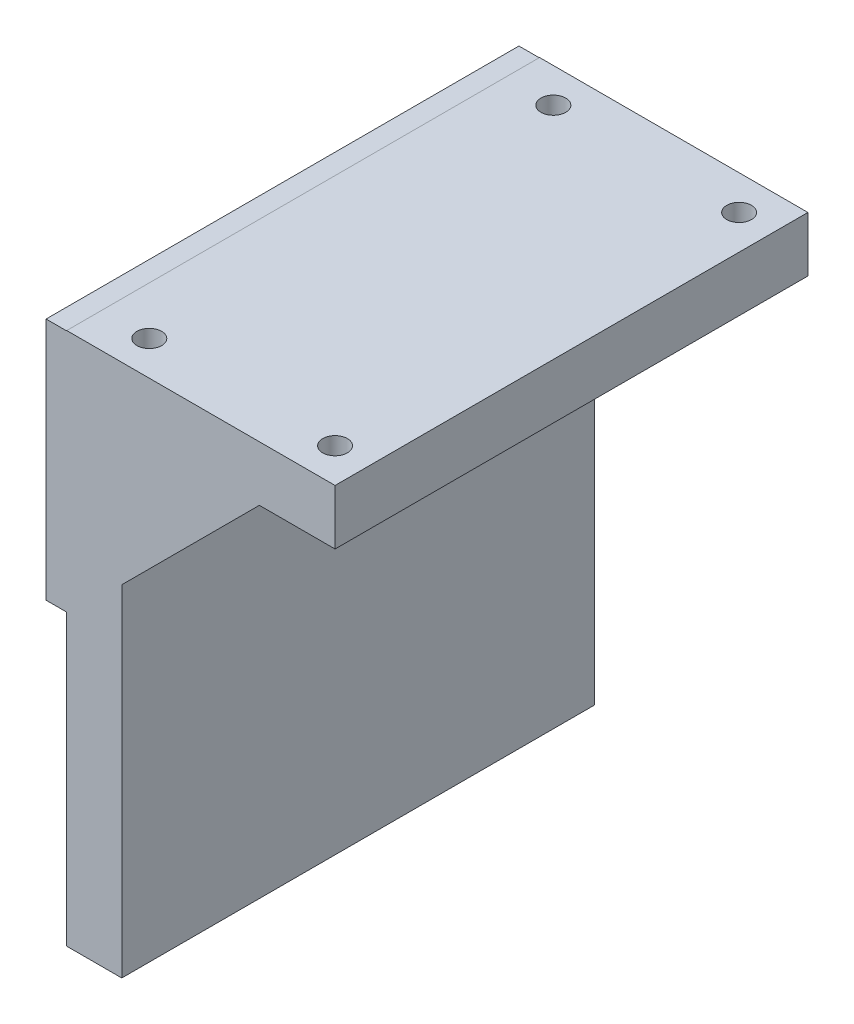
ISO-10303-21;
HEADER;
FILE_DESCRIPTION(('STEP AP214'),'2;1');
FILE_NAME('part.step','',(''),(''),'','','');
FILE_SCHEMA(('AUTOMOTIVE_DESIGN { 1 0 10303 214 1 1 1 1 }'));
ENDSEC;
DATA;
#1=APPLICATION_CONTEXT('core data for automotive mechanical design processes');
#2=APPLICATION_PROTOCOL_DEFINITION('international standard','automotive_design',2000,#1);
#3=PRODUCT_CONTEXT('',#1,'mechanical');
#4=PRODUCT('Part','Part','',(#3));
#5=PRODUCT_RELATED_PRODUCT_CATEGORY('part','',(#4));
#6=PRODUCT_DEFINITION_FORMATION('','',#4);
#7=PRODUCT_DEFINITION_CONTEXT('part definition',#1,'design');
#8=PRODUCT_DEFINITION('design','',#6,#7);
#9=PRODUCT_DEFINITION_SHAPE('','',#8);
#10=(LENGTH_UNIT() NAMED_UNIT(*) SI_UNIT(.MILLI.,.METRE.));
#11=(NAMED_UNIT(*) PLANE_ANGLE_UNIT() SI_UNIT($,.RADIAN.));
#12=(NAMED_UNIT(*) SI_UNIT($,.STERADIAN.) SOLID_ANGLE_UNIT());
#13=UNCERTAINTY_MEASURE_WITH_UNIT(LENGTH_MEASURE(1.E-05),#10,'distance_accuracy_value','');
#14=(GEOMETRIC_REPRESENTATION_CONTEXT(3) GLOBAL_UNCERTAINTY_ASSIGNED_CONTEXT((#13)) GLOBAL_UNIT_ASSIGNED_CONTEXT((#10,
#11,#12)) REPRESENTATION_CONTEXT('',''));
#15=CARTESIAN_POINT('',(0.,0.,0.));
#16=DIRECTION('',(0.,0.,1.));
#17=DIRECTION('',(1.,0.,0.));
#18=AXIS2_PLACEMENT_3D('',#15,#16,#17);
#19=CARTESIAN_POINT('',(24.362132034356,0.,-145.480815620077));
#20=DIRECTION('',(1.,0.,0.));
#21=DIRECTION('',(0.,1.,0.));
#22=AXIS2_PLACEMENT_3D('',#19,#20,#21);
#23=PLANE('',#22);
#24=DIRECTION('',(0.,0.,-1.));
#25=VECTOR('',#24,1.);
#26=CARTESIAN_POINT('',(24.362132034356,77.4464466094067,-58.724264068712));
#27=LINE('',#26,#25);
#28=CARTESIAN_POINT('',(24.362132034356,77.4464466094067,9.99999999999997));
#29=VERTEX_POINT('',#28);
#30=CARTESIAN_POINT('',(24.362132034356,77.4464466094067,-58.724264068712));
#31=VERTEX_POINT('',#30);
#32=EDGE_CURVE('E50',#29,#31,#27,.T.);
#33=ORIENTED_EDGE('',*,*,#32,.F.);
#34=DIRECTION('',(0.,1.,0.));
#35=VECTOR('',#34,1.);
#36=CARTESIAN_POINT('',(24.362132034356,0.,9.99999999999997));
#37=LINE('',#36,#35);
#38=CARTESIAN_POINT('',(24.362132034356,77.4964466094067,9.99999999999997));
#39=VERTEX_POINT('',#38);
#40=EDGE_CURVE('E212',#29,#39,#37,.T.);
#41=ORIENTED_EDGE('',*,*,#40,.T.);
#42=DIRECTION('',(0.,0.,1.));
#43=VECTOR('',#42,1.);
#44=CARTESIAN_POINT('',(24.362132034356,77.4964466094067,-145.480815620077));
#45=LINE('',#44,#43);
#46=CARTESIAN_POINT('',(24.362132034356,77.4964466094067,-58.724264068712));
#47=VERTEX_POINT('',#46);
#48=EDGE_CURVE('E217',#47,#39,#45,.T.);
#49=ORIENTED_EDGE('',*,*,#48,.F.);
#50=DIRECTION('',(0.,1.,0.));
#51=VECTOR('',#50,1.);
#52=CARTESIAN_POINT('',(24.362132034356,0.,-58.724264068712));
#53=LINE('',#52,#51);
#54=EDGE_CURVE('E55',#31,#47,#53,.T.);
#55=ORIENTED_EDGE('',*,*,#54,.F.);
#56=EDGE_LOOP('',(#33,#41,#49,#55));
#57=FACE_BOUND('',#56,.T.);
#58=ADVANCED_FACE('F33',(#57),#23,.F.);
#59=CARTESIAN_POINT('',(24.362132034356,37.,-53.724264068712));
#60=DIRECTION('',(-1.,0.,0.));
#61=DIRECTION('',(0.,-1.,0.));
#62=AXIS2_PLACEMENT_3D('',#59,#60,#61);
#63=CIRCLE('',#62,1.8);
#64=CARTESIAN_POINT('',(24.362132034356,35.2,-53.724264068712));
#65=VERTEX_POINT('',#64);
#66=EDGE_CURVE('E152',#65,#65,#63,.T.);
#67=ORIENTED_EDGE('',*,*,#66,.F.);
#68=EDGE_LOOP('',(#67));
#69=FACE_BOUND('',#68,.T.);
#70=CARTESIAN_POINT('',(24.362132034356,10.,-53.724264068712));
#71=DIRECTION('',(-1.,0.,0.));
#72=DIRECTION('',(0.,-1.,0.));
#73=AXIS2_PLACEMENT_3D('',#70,#71,#72);
#74=CIRCLE('',#73,1.8);
#75=CARTESIAN_POINT('',(24.362132034356,8.2,-53.724264068712));
#76=VERTEX_POINT('',#75);
#77=EDGE_CURVE('E153',#76,#76,#74,.T.);
#78=ORIENTED_EDGE('',*,*,#77,.F.);
#79=EDGE_LOOP('',(#78));
#80=FACE_BOUND('',#79,.T.);
#81=CARTESIAN_POINT('',(24.362132034356,10.,4.99999999999995));
#82=DIRECTION('',(-1.,0.,0.));
#83=DIRECTION('',(0.,-1.,0.));
#84=AXIS2_PLACEMENT_3D('',#81,#82,#83);
#85=CIRCLE('',#84,1.8);
#86=CARTESIAN_POINT('',(24.362132034356,8.2,4.99999999999995));
#87=VERTEX_POINT('',#86);
#88=EDGE_CURVE('E159',#87,#87,#85,.T.);
#89=ORIENTED_EDGE('',*,*,#88,.F.);
#90=EDGE_LOOP('',(#89));
#91=FACE_BOUND('',#90,.T.);
#92=CARTESIAN_POINT('',(24.362132034356,37.,4.99999999999996));
#93=DIRECTION('',(-1.,0.,0.));
#94=DIRECTION('',(0.,-1.,0.));
#95=AXIS2_PLACEMENT_3D('',#92,#93,#94);
#96=CIRCLE('',#95,1.8);
#97=CARTESIAN_POINT('',(24.362132034356,35.2,4.99999999999996));
#98=VERTEX_POINT('',#97);
#99=EDGE_CURVE('E140',#98,#98,#96,.T.);
#100=ORIENTED_EDGE('',*,*,#99,.F.);
#101=EDGE_LOOP('',(#100));
#102=FACE_BOUND('',#101,.T.);
#103=DIRECTION('',(0.,0.,1.));
#104=VECTOR('',#103,1.);
#105=CARTESIAN_POINT('',(24.362132034356,42.05,-58.7242640687119));
#106=LINE('',#105,#104);
#107=CARTESIAN_POINT('',(24.362132034356,42.05,-58.724264068712));
#108=VERTEX_POINT('',#107);
#109=CARTESIAN_POINT('',(24.362132034356,42.05,9.99999999999997));
#110=VERTEX_POINT('',#109);
#111=EDGE_CURVE('E263',#108,#110,#106,.T.);
#112=ORIENTED_EDGE('',*,*,#111,.F.);
#113=CARTESIAN_POINT('',(24.362132034356,0.,-58.724264068712));
#114=VERTEX_POINT('',#113);
#115=EDGE_CURVE('E139',#114,#108,#53,.T.);
#116=ORIENTED_EDGE('',*,*,#115,.F.);
#117=DIRECTION('',(0.,0.,1.));
#118=VECTOR('',#117,1.);
#119=CARTESIAN_POINT('',(24.362132034356,0.,-145.480815620077));
#120=LINE('',#119,#118);
#121=CARTESIAN_POINT('',(24.362132034356,0.,9.99999999999997));
#122=VERTEX_POINT('',#121);
#123=EDGE_CURVE('E216',#114,#122,#120,.T.);
#124=ORIENTED_EDGE('',*,*,#123,.T.);
#125=EDGE_CURVE('E209',#122,#110,#37,.T.);
#126=ORIENTED_EDGE('',*,*,#125,.T.);
#127=EDGE_LOOP('',(#112,#116,#124,#126));
#128=FACE_BOUND('',#127,.T.);
#129=ADVANCED_FACE('F292',(#69,#80,#91,#102,#128),#23,.F.);
#130=CARTESIAN_POINT('',(21.3621320343559,83.4964466094067,-58.7242640687119));
#131=DIRECTION('',(0.,0.,-1.));
#132=DIRECTION('',(0.,1.,0.));
#133=AXIS2_PLACEMENT_3D('',#130,#131,#132);
#134=PLANE('',#133);
#135=DIRECTION('',(1.,0.,0.));
#136=VECTOR('',#135,1.);
#137=CARTESIAN_POINT('',(32.3621320343561,69.4964466094067,-58.724264068712));
#138=LINE('',#137,#136);
#139=CARTESIAN_POINT('',(52.362132034356,69.4964466094067,-58.724264068712));
#140=VERTEX_POINT('',#139);
#141=CARTESIAN_POINT('',(63.362132034356,69.4964466094067,-58.724264068712));
#142=VERTEX_POINT('',#141);
#143=EDGE_CURVE('E207',#140,#142,#138,.T.);
#144=ORIENTED_EDGE('',*,*,#143,.F.);
#145=DIRECTION('',(0.707106781186548,0.707106781186548,0.));
#146=VECTOR('',#145,1.);
#147=CARTESIAN_POINT('',(52.362132034356,69.4964466094067,-58.724264068712));
#148=LINE('',#147,#146);
#149=CARTESIAN_POINT('',(32.362132034356,49.4964466094067,-58.724264068712));
#150=VERTEX_POINT('',#149);
#151=EDGE_CURVE('E197',#150,#140,#148,.T.);
#152=ORIENTED_EDGE('',*,*,#151,.F.);
#153=DIRECTION('',(0.,1.,0.));
#154=VECTOR('',#153,1.);
#155=CARTESIAN_POINT('',(32.362132034356,0.,-58.724264068712));
#156=LINE('',#155,#154);
#157=CARTESIAN_POINT('',(32.362132034356,0.,-58.724264068712));
#158=VERTEX_POINT('',#157);
#159=EDGE_CURVE('E11',#158,#150,#156,.T.);
#160=ORIENTED_EDGE('',*,*,#159,.F.);
#161=DIRECTION('',(1.,0.,0.));
#162=VECTOR('',#161,1.);
#163=CARTESIAN_POINT('',(24.3621320343561,0.,-58.724264068712));
#164=LINE('',#163,#162);
#165=EDGE_CURVE('E211',#114,#158,#164,.T.);
#166=ORIENTED_EDGE('',*,*,#165,.F.);
#167=ORIENTED_EDGE('',*,*,#115,.T.);
#168=DIRECTION('',(1.,0.,0.));
#169=VECTOR('',#168,1.);
#170=CARTESIAN_POINT('',(21.3621320343559,42.05,-58.7242640687119));
#171=LINE('',#170,#169);
#172=CARTESIAN_POINT('',(21.3621320343559,42.05,-58.7242640687119));
#173=VERTEX_POINT('',#172);
#174=EDGE_CURVE('E120',#173,#108,#171,.T.);
#175=ORIENTED_EDGE('',*,*,#174,.F.);
#176=DIRECTION('',(0.,-1.,0.));
#177=VECTOR('',#176,1.);
#178=CARTESIAN_POINT('',(21.3621320343559,77.4464466094067,-58.724264068712));
#179=LINE('',#178,#177);
#180=CARTESIAN_POINT('',(21.3621320343559,77.4464466094067,-58.724264068712));
#181=VERTEX_POINT('',#180);
#182=EDGE_CURVE('E126',#181,#173,#179,.T.);
#183=ORIENTED_EDGE('',*,*,#182,.F.);
#184=DIRECTION('',(1.,0.,0.));
#185=VECTOR('',#184,1.);
#186=CARTESIAN_POINT('',(21.3621320343559,77.4464466094067,-58.724264068712));
#187=LINE('',#186,#185);
#188=EDGE_CURVE('E255',#181,#31,#187,.T.);
#189=ORIENTED_EDGE('',*,*,#188,.T.);
#190=ORIENTED_EDGE('',*,*,#54,.T.);
#191=DIRECTION('',(1.,0.,0.));
#192=VECTOR('',#191,1.);
#193=CARTESIAN_POINT('',(24.3621320343561,77.4964466094067,-58.724264068712));
#194=LINE('',#193,#192);
#195=CARTESIAN_POINT('',(63.362132034356,77.4964466094066,-58.724264068712));
#196=VERTEX_POINT('',#195);
#197=EDGE_CURVE('E225',#47,#196,#194,.T.);
#198=ORIENTED_EDGE('',*,*,#197,.T.);
#199=DIRECTION('',(0.,1.,0.));
#200=VECTOR('',#199,1.);
#201=CARTESIAN_POINT('',(63.362132034356,69.4964466094067,-58.724264068712));
#202=LINE('',#201,#200);
#203=EDGE_CURVE('E231',#142,#196,#202,.T.);
#204=ORIENTED_EDGE('',*,*,#203,.F.);
#205=EDGE_LOOP('',(#144,#152,#160,#166,#167,#175,#183,#189,#190,#198,#204));
#206=FACE_BOUND('',#205,.T.);
#207=ADVANCED_FACE('F35',(#206),#134,.T.);
#208=CARTESIAN_POINT('',(0.,0.,9.99999999999997));
#209=DIRECTION('',(0.,0.,-1.));
#210=DIRECTION('',(-1.,0.,0.));
#211=AXIS2_PLACEMENT_3D('',#208,#209,#210);
#212=PLANE('',#211);
#213=DIRECTION('',(0.707106781186548,0.707106781186548,0.));
#214=VECTOR('',#213,1.);
#215=CARTESIAN_POINT('',(52.362132034356,69.4964466094067,9.99999999999997));
#216=LINE('',#215,#214);
#217=CARTESIAN_POINT('',(32.362132034356,49.4964466094067,9.99999999999997));
#218=VERTEX_POINT('',#217);
#219=CARTESIAN_POINT('',(52.362132034356,69.4964466094067,9.99999999999997));
#220=VERTEX_POINT('',#219);
#221=EDGE_CURVE('E191',#218,#220,#216,.T.);
#222=ORIENTED_EDGE('',*,*,#221,.T.);
#223=DIRECTION('',(1.,0.,0.));
#224=VECTOR('',#223,1.);
#225=CARTESIAN_POINT('',(32.362132034356,69.4964466094067,9.99999999999997));
#226=LINE('',#225,#224);
#227=CARTESIAN_POINT('',(63.362132034356,69.4964466094067,9.99999999999997));
#228=VERTEX_POINT('',#227);
#229=EDGE_CURVE('E220',#220,#228,#226,.T.);
#230=ORIENTED_EDGE('',*,*,#229,.T.);
#231=DIRECTION('',(0.,1.,0.));
#232=VECTOR('',#231,1.);
#233=CARTESIAN_POINT('',(63.362132034356,69.4964466094067,9.99999999999997));
#234=LINE('',#233,#232);
#235=CARTESIAN_POINT('',(63.362132034356,77.4964466094066,9.99999999999997));
#236=VERTEX_POINT('',#235);
#237=EDGE_CURVE('E208',#228,#236,#234,.T.);
#238=ORIENTED_EDGE('',*,*,#237,.T.);
#239=DIRECTION('',(1.,0.,0.));
#240=VECTOR('',#239,1.);
#241=CARTESIAN_POINT('',(24.362132034356,77.4964466094067,9.99999999999997));
#242=LINE('',#241,#240);
#243=EDGE_CURVE('E213',#39,#236,#242,.T.);
#244=ORIENTED_EDGE('',*,*,#243,.F.);
#245=ORIENTED_EDGE('',*,*,#40,.F.);
#246=DIRECTION('',(1.,0.,0.));
#247=VECTOR('',#246,1.);
#248=CARTESIAN_POINT('',(21.3621320343559,77.4464466094067,9.99999999999997));
#249=LINE('',#248,#247);
#250=CARTESIAN_POINT('',(21.3621320343559,77.4464466094067,9.99999999999997));
#251=VERTEX_POINT('',#250);
#252=EDGE_CURVE('E145',#251,#29,#249,.T.);
#253=ORIENTED_EDGE('',*,*,#252,.F.);
#254=DIRECTION('',(0.,1.,0.));
#255=VECTOR('',#254,1.);
#256=CARTESIAN_POINT('',(21.3621320343559,77.4464466094067,9.99999999999997));
#257=LINE('',#256,#255);
#258=CARTESIAN_POINT('',(21.3621320343559,42.05,9.99999999999997));
#259=VERTEX_POINT('',#258);
#260=EDGE_CURVE('E125',#259,#251,#257,.T.);
#261=ORIENTED_EDGE('',*,*,#260,.F.);
#262=DIRECTION('',(1.,0.,0.));
#263=VECTOR('',#262,1.);
#264=CARTESIAN_POINT('',(21.3621320343559,42.05,9.99999999999997));
#265=LINE('',#264,#263);
#266=EDGE_CURVE('E122',#259,#110,#265,.T.);
#267=ORIENTED_EDGE('',*,*,#266,.T.);
#268=ORIENTED_EDGE('',*,*,#125,.F.);
#269=DIRECTION('',(1.,0.,0.));
#270=VECTOR('',#269,1.);
#271=CARTESIAN_POINT('',(24.362132034356,0.,9.99999999999997));
#272=LINE('',#271,#270);
#273=CARTESIAN_POINT('',(32.362132034356,0.,9.99999999999997));
#274=VERTEX_POINT('',#273);
#275=EDGE_CURVE('E204',#122,#274,#272,.T.);
#276=ORIENTED_EDGE('',*,*,#275,.T.);
#277=DIRECTION('',(0.,1.,0.));
#278=VECTOR('',#277,1.);
#279=CARTESIAN_POINT('',(32.362132034356,0.,9.99999999999997));
#280=LINE('',#279,#278);
#281=EDGE_CURVE('E222',#274,#218,#280,.T.);
#282=ORIENTED_EDGE('',*,*,#281,.T.);
#283=EDGE_LOOP('',(#222,#230,#238,#244,#245,#253,#261,#267,#268,#276,#282));
#284=FACE_BOUND('',#283,.T.);
#285=ADVANCED_FACE('F249',(#284),#212,.F.);
#286=CARTESIAN_POINT('',(32.362132034356,69.4964466094067,-145.480815620077));
#287=DIRECTION('',(0.,-1.,0.));
#288=DIRECTION('',(0.,0.,-1.));
#289=AXIS2_PLACEMENT_3D('',#286,#287,#288);
#290=PLANE('',#289);
#291=DIRECTION('',(0.,0.,1.));
#292=VECTOR('',#291,1.);
#293=CARTESIAN_POINT('',(52.362132034356,69.4964466094067,-87.0085353161738));
#294=LINE('',#293,#292);
#295=EDGE_CURVE('E200',#140,#220,#294,.T.);
#296=ORIENTED_EDGE('',*,*,#295,.F.);
#297=ORIENTED_EDGE('',*,*,#143,.T.);
#298=DIRECTION('',(0.,0.,1.));
#299=VECTOR('',#298,1.);
#300=CARTESIAN_POINT('',(63.362132034356,69.4964466094067,-145.480815620077));
#301=LINE('',#300,#299);
#302=EDGE_CURVE('E37',#142,#228,#301,.T.);
#303=ORIENTED_EDGE('',*,*,#302,.T.);
#304=ORIENTED_EDGE('',*,*,#229,.F.);
#305=EDGE_LOOP('',(#296,#297,#303,#304));
#306=FACE_BOUND('',#305,.T.);
#307=ADVANCED_FACE('F253',(#306),#290,.T.);
#308=CARTESIAN_POINT('',(63.362132034356,69.4964466094067,-145.480815620077));
#309=DIRECTION('',(1.,0.,0.));
#310=DIRECTION('',(0.,0.,-1.));
#311=AXIS2_PLACEMENT_3D('',#308,#309,#310);
#312=PLANE('',#311);
#313=ORIENTED_EDGE('',*,*,#302,.F.);
#314=ORIENTED_EDGE('',*,*,#203,.T.);
#315=DIRECTION('',(0.,0.,1.));
#316=VECTOR('',#315,1.);
#317=CARTESIAN_POINT('',(63.362132034356,77.4964466094066,-145.480815620077));
#318=LINE('',#317,#316);
#319=EDGE_CURVE('E234',#196,#236,#318,.T.);
#320=ORIENTED_EDGE('',*,*,#319,.T.);
#321=ORIENTED_EDGE('',*,*,#237,.F.);
#322=EDGE_LOOP('',(#313,#314,#320,#321));
#323=FACE_BOUND('',#322,.T.);
#324=ADVANCED_FACE('F242',(#323),#312,.T.);
#325=CARTESIAN_POINT('',(24.362132034356,77.4964466094067,-145.480815620077));
#326=DIRECTION('',(0.,-1.,0.));
#327=DIRECTION('',(1.,0.,0.));
#328=AXIS2_PLACEMENT_3D('',#325,#326,#327);
#329=PLANE('',#328);
#330=CARTESIAN_POINT('',(31.3621320343559,77.4964466094067,-53.724264068712));
#331=DIRECTION('',(0.,1.,0.));
#332=DIRECTION('',(-1.,0.,0.));
#333=AXIS2_PLACEMENT_3D('',#330,#331,#332);
#334=CIRCLE('',#333,1.8);
#335=CARTESIAN_POINT('',(29.5621320343559,77.4964466094067,-53.724264068712));
#336=VERTEX_POINT('',#335);
#337=EDGE_CURVE('E180',#336,#336,#334,.T.);
#338=ORIENTED_EDGE('',*,*,#337,.F.);
#339=EDGE_LOOP('',(#338));
#340=FACE_BOUND('',#339,.T.);
#341=CARTESIAN_POINT('',(58.362132034356,77.4964466094066,4.99999999999994));
#342=DIRECTION('',(0.,1.,0.));
#343=DIRECTION('',(-1.,0.,0.));
#344=AXIS2_PLACEMENT_3D('',#341,#342,#343);
#345=CIRCLE('',#344,1.8);
#346=CARTESIAN_POINT('',(56.562132034356,77.4964466094066,4.99999999999994));
#347=VERTEX_POINT('',#346);
#348=EDGE_CURVE('E173',#347,#347,#345,.T.);
#349=ORIENTED_EDGE('',*,*,#348,.F.);
#350=EDGE_LOOP('',(#349));
#351=FACE_BOUND('',#350,.T.);
#352=CARTESIAN_POINT('',(31.362132034356,77.4964466094067,4.99999999999996));
#353=DIRECTION('',(0.,1.,0.));
#354=DIRECTION('',(-1.,0.,0.));
#355=AXIS2_PLACEMENT_3D('',#352,#353,#354);
#356=CIRCLE('',#355,1.8);
#357=CARTESIAN_POINT('',(29.562132034356,77.4964466094067,4.99999999999996));
#358=VERTEX_POINT('',#357);
#359=EDGE_CURVE('E167',#358,#358,#356,.T.);
#360=ORIENTED_EDGE('',*,*,#359,.F.);
#361=EDGE_LOOP('',(#360));
#362=FACE_BOUND('',#361,.T.);
#363=CARTESIAN_POINT('',(58.3621320343559,77.4964466094066,-53.724264068712));
#364=DIRECTION('',(0.,1.,0.));
#365=DIRECTION('',(-1.,0.,0.));
#366=AXIS2_PLACEMENT_3D('',#363,#364,#365);
#367=CIRCLE('',#366,1.8);
#368=CARTESIAN_POINT('',(56.5621320343559,77.4964466094066,-53.724264068712));
#369=VERTEX_POINT('',#368);
#370=EDGE_CURVE('E179',#369,#369,#367,.T.);
#371=ORIENTED_EDGE('',*,*,#370,.F.);
#372=EDGE_LOOP('',(#371));
#373=FACE_BOUND('',#372,.T.);
#374=ORIENTED_EDGE('',*,*,#197,.F.);
#375=ORIENTED_EDGE('',*,*,#48,.T.);
#376=ORIENTED_EDGE('',*,*,#243,.T.);
#377=ORIENTED_EDGE('',*,*,#319,.F.);
#378=EDGE_LOOP('',(#374,#375,#376,#377));
#379=FACE_BOUND('',#378,.T.);
#380=ADVANCED_FACE('F247',(#340,#351,#362,#373,#379),#329,.F.);
#381=CARTESIAN_POINT('',(24.362132034356,0.,-145.480815620077));
#382=DIRECTION('',(0.,-1.,0.));
#383=DIRECTION('',(0.,0.,-1.));
#384=AXIS2_PLACEMENT_3D('',#381,#382,#383);
#385=PLANE('',#384);
#386=ORIENTED_EDGE('',*,*,#123,.F.);
#387=ORIENTED_EDGE('',*,*,#165,.T.);
#388=DIRECTION('',(0.,0.,1.));
#389=VECTOR('',#388,1.);
#390=CARTESIAN_POINT('',(32.362132034356,0.,-145.480815620077));
#391=LINE('',#390,#389);
#392=EDGE_CURVE('E42',#158,#274,#391,.T.);
#393=ORIENTED_EDGE('',*,*,#392,.T.);
#394=ORIENTED_EDGE('',*,*,#275,.F.);
#395=EDGE_LOOP('',(#386,#387,#393,#394));
#396=FACE_BOUND('',#395,.T.);
#397=ADVANCED_FACE('F271',(#396),#385,.T.);
#398=CARTESIAN_POINT('',(32.362132034356,0.,-145.480815620077));
#399=DIRECTION('',(1.,0.,0.));
#400=DIRECTION('',(0.,0.,-1.));
#401=AXIS2_PLACEMENT_3D('',#398,#399,#400);
#402=PLANE('',#401);
#403=DIRECTION('',(0.,0.,1.));
#404=VECTOR('',#403,1.);
#405=CARTESIAN_POINT('',(32.362132034356,49.4964466094067,-87.0085353161738));
#406=LINE('',#405,#404);
#407=EDGE_CURVE('E196',#150,#218,#406,.T.);
#408=ORIENTED_EDGE('',*,*,#407,.T.);
#409=ORIENTED_EDGE('',*,*,#281,.F.);
#410=ORIENTED_EDGE('',*,*,#392,.F.);
#411=ORIENTED_EDGE('',*,*,#159,.T.);
#412=EDGE_LOOP('',(#408,#409,#410,#411));
#413=FACE_BOUND('',#412,.T.);
#414=ADVANCED_FACE('F275',(#413),#402,.T.);
#415=CARTESIAN_POINT('',(52.362132034356,69.4964466094067,-87.0085353161738));
#416=DIRECTION('',(0.707106781186548,-0.707106781186548,0.));
#417=DIRECTION('',(0.707106781186548,0.707106781186548,0.));
#418=AXIS2_PLACEMENT_3D('',#415,#416,#417);
#419=PLANE('',#418);
#420=ORIENTED_EDGE('',*,*,#407,.F.);
#421=ORIENTED_EDGE('',*,*,#151,.T.);
#422=ORIENTED_EDGE('',*,*,#295,.T.);
#423=ORIENTED_EDGE('',*,*,#221,.F.);
#424=EDGE_LOOP('',(#420,#421,#422,#423));
#425=FACE_BOUND('',#424,.T.);
#426=ADVANCED_FACE('F278',(#425),#419,.T.);
#427=CARTESIAN_POINT('',(58.3621320343559,71.4964466094066,-53.724264068712));
#428=DIRECTION('',(0.,1.,0.));
#429=DIRECTION('',(-1.,0.,0.));
#430=AXIS2_PLACEMENT_3D('',#427,#428,#429);
#431=CYLINDRICAL_SURFACE('',#430,1.8);
#432=CARTESIAN_POINT('',(58.3621320343559,71.4964466094066,-53.724264068712));
#433=DIRECTION('',(0.,1.,0.));
#434=DIRECTION('',(-1.,0.,0.));
#435=AXIS2_PLACEMENT_3D('',#432,#433,#434);
#436=CIRCLE('',#435,1.8);
#437=CARTESIAN_POINT('',(56.5621320343559,71.4964466094066,-53.724264068712));
#438=VERTEX_POINT('',#437);
#439=EDGE_CURVE('E188',#438,#438,#436,.T.);
#440=ORIENTED_EDGE('',*,*,#439,.F.);
#441=EDGE_LOOP('',(#440));
#442=FACE_BOUND('',#441,.T.);
#443=ORIENTED_EDGE('',*,*,#370,.T.);
#444=EDGE_LOOP('',(#443));
#445=FACE_BOUND('',#444,.T.);
#446=ADVANCED_FACE('F280',(#442,#445),#431,.F.);
#447=CARTESIAN_POINT('',(58.3621320343559,71.4964466094066,-53.724264068712));
#448=DIRECTION('',(0.,1.,0.));
#449=DIRECTION('',(-1.,0.,0.));
#450=AXIS2_PLACEMENT_3D('',#447,#448,#449);
#451=PLANE('',#450);
#452=ORIENTED_EDGE('',*,*,#439,.T.);
#453=EDGE_LOOP('',(#452));
#454=FACE_BOUND('',#453,.T.);
#455=ADVANCED_FACE('F286',(#454),#451,.T.);
#456=CARTESIAN_POINT('',(31.362132034356,71.4964466094067,4.99999999999996));
#457=DIRECTION('',(0.,1.,0.));
#458=DIRECTION('',(-1.,0.,0.));
#459=AXIS2_PLACEMENT_3D('',#456,#457,#458);
#460=CYLINDRICAL_SURFACE('',#459,1.8);
#461=CARTESIAN_POINT('',(31.362132034356,71.4964466094067,4.99999999999996));
#462=DIRECTION('',(0.,1.,0.));
#463=DIRECTION('',(-1.,0.,0.));
#464=AXIS2_PLACEMENT_3D('',#461,#462,#463);
#465=CIRCLE('',#464,1.8);
#466=CARTESIAN_POINT('',(29.562132034356,71.4964466094067,4.99999999999996));
#467=VERTEX_POINT('',#466);
#468=EDGE_CURVE('E170',#467,#467,#465,.T.);
#469=ORIENTED_EDGE('',*,*,#468,.F.);
#470=EDGE_LOOP('',(#469));
#471=FACE_BOUND('',#470,.T.);
#472=ORIENTED_EDGE('',*,*,#359,.T.);
#473=EDGE_LOOP('',(#472));
#474=FACE_BOUND('',#473,.T.);
#475=ADVANCED_FACE('F426',(#471,#474),#460,.F.);
#476=CARTESIAN_POINT('',(31.362132034356,71.4964466094067,4.99999999999996));
#477=DIRECTION('',(0.,1.,0.));
#478=DIRECTION('',(-1.,0.,0.));
#479=AXIS2_PLACEMENT_3D('',#476,#477,#478);
#480=PLANE('',#479);
#481=ORIENTED_EDGE('',*,*,#468,.T.);
#482=EDGE_LOOP('',(#481));
#483=FACE_BOUND('',#482,.T.);
#484=ADVANCED_FACE('F418',(#483),#480,.T.);
#485=CARTESIAN_POINT('',(58.362132034356,71.4964466094066,4.99999999999994));
#486=DIRECTION('',(0.,1.,0.));
#487=DIRECTION('',(-1.,0.,0.));
#488=AXIS2_PLACEMENT_3D('',#485,#486,#487);
#489=CYLINDRICAL_SURFACE('',#488,1.8);
#490=CARTESIAN_POINT('',(58.362132034356,71.4964466094066,4.99999999999994));
#491=DIRECTION('',(0.,1.,0.));
#492=DIRECTION('',(-1.,0.,0.));
#493=AXIS2_PLACEMENT_3D('',#490,#491,#492);
#494=CIRCLE('',#493,1.8);
#495=CARTESIAN_POINT('',(56.562132034356,71.4964466094066,4.99999999999994));
#496=VERTEX_POINT('',#495);
#497=EDGE_CURVE('E183',#496,#496,#494,.T.);
#498=ORIENTED_EDGE('',*,*,#497,.F.);
#499=EDGE_LOOP('',(#498));
#500=FACE_BOUND('',#499,.T.);
#501=ORIENTED_EDGE('',*,*,#348,.T.);
#502=EDGE_LOOP('',(#501));
#503=FACE_BOUND('',#502,.T.);
#504=ADVANCED_FACE('F410',(#500,#503),#489,.F.);
#505=CARTESIAN_POINT('',(58.362132034356,71.4964466094066,4.99999999999994));
#506=DIRECTION('',(0.,1.,0.));
#507=DIRECTION('',(-1.,0.,0.));
#508=AXIS2_PLACEMENT_3D('',#505,#506,#507);
#509=PLANE('',#508);
#510=ORIENTED_EDGE('',*,*,#497,.T.);
#511=EDGE_LOOP('',(#510));
#512=FACE_BOUND('',#511,.T.);
#513=ADVANCED_FACE('F402',(#512),#509,.T.);
#514=CARTESIAN_POINT('',(31.3621320343559,71.4964466094067,-53.724264068712));
#515=DIRECTION('',(0.,1.,0.));
#516=DIRECTION('',(-1.,0.,0.));
#517=AXIS2_PLACEMENT_3D('',#514,#515,#516);
#518=CYLINDRICAL_SURFACE('',#517,1.8);
#519=CARTESIAN_POINT('',(31.3621320343559,71.4964466094067,-53.724264068712));
#520=DIRECTION('',(0.,1.,0.));
#521=DIRECTION('',(-1.,0.,0.));
#522=AXIS2_PLACEMENT_3D('',#519,#520,#521);
#523=CIRCLE('',#522,1.8);
#524=CARTESIAN_POINT('',(29.5621320343559,71.4964466094067,-53.724264068712));
#525=VERTEX_POINT('',#524);
#526=EDGE_CURVE('E176',#525,#525,#523,.T.);
#527=ORIENTED_EDGE('',*,*,#526,.F.);
#528=EDGE_LOOP('',(#527));
#529=FACE_BOUND('',#528,.T.);
#530=ORIENTED_EDGE('',*,*,#337,.T.);
#531=EDGE_LOOP('',(#530));
#532=FACE_BOUND('',#531,.T.);
#533=ADVANCED_FACE('F394',(#529,#532),#518,.F.);
#534=CARTESIAN_POINT('',(31.3621320343559,71.4964466094067,-53.724264068712));
#535=DIRECTION('',(0.,1.,0.));
#536=DIRECTION('',(-1.,0.,0.));
#537=AXIS2_PLACEMENT_3D('',#534,#535,#536);
#538=PLANE('',#537);
#539=ORIENTED_EDGE('',*,*,#526,.T.);
#540=EDGE_LOOP('',(#539));
#541=FACE_BOUND('',#540,.T.);
#542=ADVANCED_FACE('F386',(#541),#538,.T.);
#543=CARTESIAN_POINT('',(30.362132034356,37.,-53.724264068712));
#544=DIRECTION('',(-1.,0.,0.));
#545=DIRECTION('',(0.,-1.,0.));
#546=AXIS2_PLACEMENT_3D('',#543,#544,#545);
#547=CYLINDRICAL_SURFACE('',#546,1.8);
#548=CARTESIAN_POINT('',(30.362132034356,37.,-53.724264068712));
#549=DIRECTION('',(-1.,0.,0.));
#550=DIRECTION('',(0.,-1.,0.));
#551=AXIS2_PLACEMENT_3D('',#548,#549,#550);
#552=CIRCLE('',#551,1.8);
#553=CARTESIAN_POINT('',(30.362132034356,35.2,-53.724264068712));
#554=VERTEX_POINT('',#553);
#555=EDGE_CURVE('E164',#554,#554,#552,.T.);
#556=ORIENTED_EDGE('',*,*,#555,.F.);
#557=EDGE_LOOP('',(#556));
#558=FACE_BOUND('',#557,.T.);
#559=ORIENTED_EDGE('',*,*,#66,.T.);
#560=EDGE_LOOP('',(#559));
#561=FACE_BOUND('',#560,.T.);
#562=ADVANCED_FACE('F378',(#558,#561),#547,.F.);
#563=CARTESIAN_POINT('',(30.362132034356,37.,-53.724264068712));
#564=DIRECTION('',(-1.,0.,0.));
#565=DIRECTION('',(0.,-1.,0.));
#566=AXIS2_PLACEMENT_3D('',#563,#564,#565);
#567=PLANE('',#566);
#568=ORIENTED_EDGE('',*,*,#555,.T.);
#569=EDGE_LOOP('',(#568));
#570=FACE_BOUND('',#569,.T.);
#571=ADVANCED_FACE('F370',(#570),#567,.T.);
#572=CARTESIAN_POINT('',(30.362132034356,10.,-53.724264068712));
#573=DIRECTION('',(-1.,0.,0.));
#574=DIRECTION('',(0.,-1.,0.));
#575=AXIS2_PLACEMENT_3D('',#572,#573,#574);
#576=CYLINDRICAL_SURFACE('',#575,1.8);
#577=CARTESIAN_POINT('',(30.362132034356,10.,-53.724264068712));
#578=DIRECTION('',(-1.,0.,0.));
#579=DIRECTION('',(0.,-1.,0.));
#580=AXIS2_PLACEMENT_3D('',#577,#578,#579);
#581=CIRCLE('',#580,1.8);
#582=CARTESIAN_POINT('',(30.362132034356,8.2,-53.724264068712));
#583=VERTEX_POINT('',#582);
#584=EDGE_CURVE('E149',#583,#583,#581,.T.);
#585=ORIENTED_EDGE('',*,*,#584,.F.);
#586=EDGE_LOOP('',(#585));
#587=FACE_BOUND('',#586,.T.);
#588=ORIENTED_EDGE('',*,*,#77,.T.);
#589=EDGE_LOOP('',(#588));
#590=FACE_BOUND('',#589,.T.);
#591=ADVANCED_FACE('F362',(#587,#590),#576,.F.);
#592=CARTESIAN_POINT('',(30.362132034356,10.,-53.724264068712));
#593=DIRECTION('',(-1.,0.,0.));
#594=DIRECTION('',(0.,-1.,0.));
#595=AXIS2_PLACEMENT_3D('',#592,#593,#594);
#596=PLANE('',#595);
#597=ORIENTED_EDGE('',*,*,#584,.T.);
#598=EDGE_LOOP('',(#597));
#599=FACE_BOUND('',#598,.T.);
#600=ADVANCED_FACE('F354',(#599),#596,.T.);
#601=CARTESIAN_POINT('',(30.362132034356,10.,4.99999999999995));
#602=DIRECTION('',(-1.,0.,0.));
#603=DIRECTION('',(0.,-1.,0.));
#604=AXIS2_PLACEMENT_3D('',#601,#602,#603);
#605=CYLINDRICAL_SURFACE('',#604,1.8);
#606=CARTESIAN_POINT('',(30.362132034356,10.,4.99999999999995));
#607=DIRECTION('',(-1.,0.,0.));
#608=DIRECTION('',(0.,-1.,0.));
#609=AXIS2_PLACEMENT_3D('',#606,#607,#608);
#610=CIRCLE('',#609,1.8);
#611=CARTESIAN_POINT('',(30.362132034356,8.2,4.99999999999995));
#612=VERTEX_POINT('',#611);
#613=EDGE_CURVE('E156',#612,#612,#610,.T.);
#614=ORIENTED_EDGE('',*,*,#613,.F.);
#615=EDGE_LOOP('',(#614));
#616=FACE_BOUND('',#615,.T.);
#617=ORIENTED_EDGE('',*,*,#88,.T.);
#618=EDGE_LOOP('',(#617));
#619=FACE_BOUND('',#618,.T.);
#620=ADVANCED_FACE('F346',(#616,#619),#605,.F.);
#621=CARTESIAN_POINT('',(30.362132034356,10.,4.99999999999995));
#622=DIRECTION('',(-1.,0.,0.));
#623=DIRECTION('',(0.,-1.,0.));
#624=AXIS2_PLACEMENT_3D('',#621,#622,#623);
#625=PLANE('',#624);
#626=ORIENTED_EDGE('',*,*,#613,.T.);
#627=EDGE_LOOP('',(#626));
#628=FACE_BOUND('',#627,.T.);
#629=ADVANCED_FACE('F338',(#628),#625,.T.);
#630=CARTESIAN_POINT('',(30.362132034356,37.,4.99999999999996));
#631=DIRECTION('',(-1.,0.,0.));
#632=DIRECTION('',(0.,-1.,0.));
#633=AXIS2_PLACEMENT_3D('',#630,#631,#632);
#634=CYLINDRICAL_SURFACE('',#633,1.8);
#635=CARTESIAN_POINT('',(30.362132034356,37.,4.99999999999996));
#636=DIRECTION('',(-1.,0.,0.));
#637=DIRECTION('',(0.,-1.,0.));
#638=AXIS2_PLACEMENT_3D('',#635,#636,#637);
#639=CIRCLE('',#638,1.8);
#640=CARTESIAN_POINT('',(30.362132034356,35.2,4.99999999999996));
#641=VERTEX_POINT('',#640);
#642=EDGE_CURVE('E143',#641,#641,#639,.T.);
#643=ORIENTED_EDGE('',*,*,#642,.F.);
#644=EDGE_LOOP('',(#643));
#645=FACE_BOUND('',#644,.T.);
#646=ORIENTED_EDGE('',*,*,#99,.T.);
#647=EDGE_LOOP('',(#646));
#648=FACE_BOUND('',#647,.T.);
#649=ADVANCED_FACE('F331',(#645,#648),#634,.F.);
#650=CARTESIAN_POINT('',(30.362132034356,37.,4.99999999999996));
#651=DIRECTION('',(-1.,0.,0.));
#652=DIRECTION('',(0.,-1.,0.));
#653=AXIS2_PLACEMENT_3D('',#650,#651,#652);
#654=PLANE('',#653);
#655=ORIENTED_EDGE('',*,*,#642,.T.);
#656=EDGE_LOOP('',(#655));
#657=FACE_BOUND('',#656,.T.);
#658=ADVANCED_FACE('F328',(#657),#654,.T.);
#659=CARTESIAN_POINT('',(21.3621320343559,42.05,-58.7242640687119));
#660=DIRECTION('',(0.,1.,0.));
#661=DIRECTION('',(-1.,0.,0.));
#662=AXIS2_PLACEMENT_3D('',#659,#660,#661);
#663=PLANE('',#662);
#664=ORIENTED_EDGE('',*,*,#111,.T.);
#665=ORIENTED_EDGE('',*,*,#266,.F.);
#666=DIRECTION('',(0.,0.,1.));
#667=VECTOR('',#666,1.);
#668=CARTESIAN_POINT('',(21.3621320343559,42.05,-58.7242640687119));
#669=LINE('',#668,#667);
#670=EDGE_CURVE('E115',#173,#259,#669,.T.);
#671=ORIENTED_EDGE('',*,*,#670,.F.);
#672=ORIENTED_EDGE('',*,*,#174,.T.);
#673=EDGE_LOOP('',(#664,#665,#671,#672));
#674=FACE_BOUND('',#673,.T.);
#675=ADVANCED_FACE('F118',(#674),#663,.F.);
#676=CARTESIAN_POINT('',(21.3621320343559,77.4464466094067,-58.724264068712));
#677=DIRECTION('',(0.,-1.,0.));
#678=DIRECTION('',(1.,0.,0.));
#679=AXIS2_PLACEMENT_3D('',#676,#677,#678);
#680=PLANE('',#679);
#681=ORIENTED_EDGE('',*,*,#32,.T.);
#682=ORIENTED_EDGE('',*,*,#188,.F.);
#683=DIRECTION('',(0.,0.,-1.));
#684=VECTOR('',#683,1.);
#685=CARTESIAN_POINT('',(21.3621320343559,77.4464466094067,-58.724264068712));
#686=LINE('',#685,#684);
#687=EDGE_CURVE('E131',#251,#181,#686,.T.);
#688=ORIENTED_EDGE('',*,*,#687,.F.);
#689=ORIENTED_EDGE('',*,*,#252,.T.);
#690=EDGE_LOOP('',(#681,#682,#688,#689));
#691=FACE_BOUND('',#690,.T.);
#692=ADVANCED_FACE('F259',(#691),#680,.F.);
#693=CARTESIAN_POINT('',(21.3621320343559,0.,0.));
#694=DIRECTION('',(-1.,0.,0.));
#695=DIRECTION('',(0.,0.,1.));
#696=AXIS2_PLACEMENT_3D('',#693,#694,#695);
#697=PLANE('',#696);
#698=ORIENTED_EDGE('',*,*,#182,.T.);
#699=ORIENTED_EDGE('',*,*,#670,.T.);
#700=ORIENTED_EDGE('',*,*,#260,.T.);
#701=ORIENTED_EDGE('',*,*,#687,.T.);
#702=EDGE_LOOP('',(#698,#699,#700,#701));
#703=FACE_BOUND('',#702,.T.);
#704=ADVANCED_FACE('F129',(#703),#697,.T.);
#705=CLOSED_SHELL('',(#58,#129,#207,#285,#307,#324,#380,#397,#414,#426,#446,#455,#475,#484,#504,
#513,#533,#542,#562,#571,#591,#600,#620,#629,#649,#658,#675,#692,#704));
#706=MANIFOLD_SOLID_BREP('B2',#705);
#707=ADVANCED_BREP_SHAPE_REPRESENTATION('',(#18,#706),#14);
#708=SHAPE_DEFINITION_REPRESENTATION(#9,#707);
ENDSEC;
END-ISO-10303-21;
